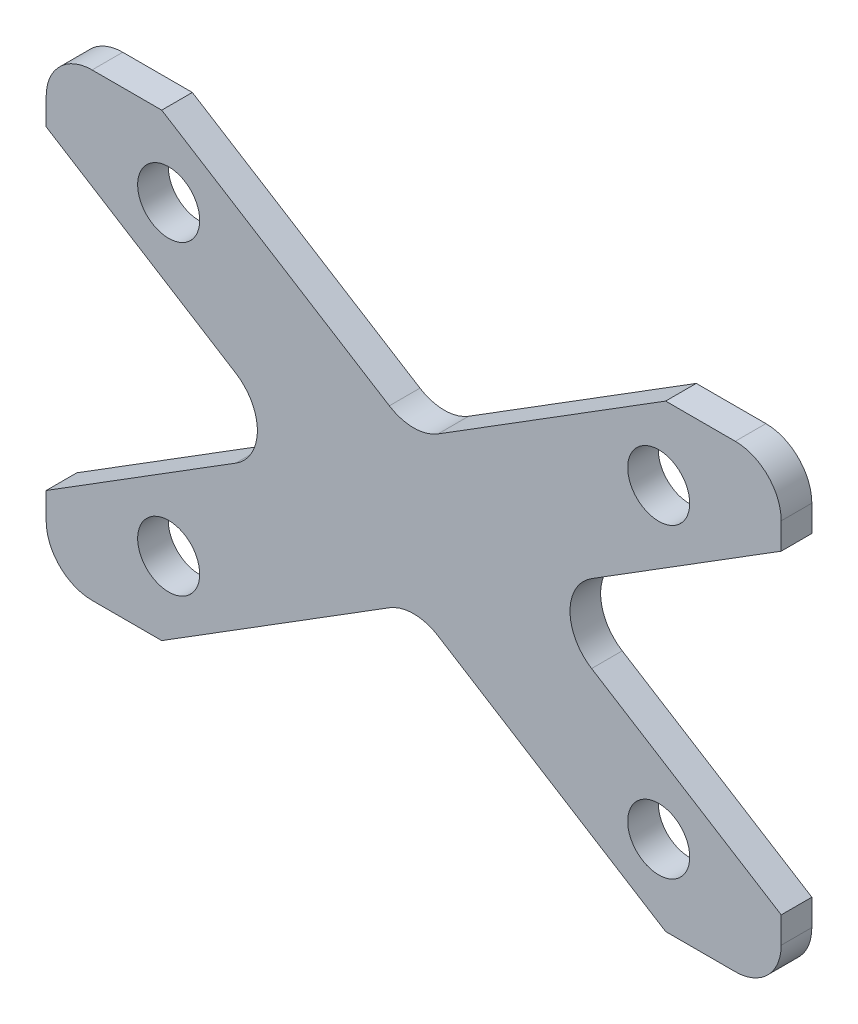
ISO-10303-21;
HEADER;
FILE_DESCRIPTION(('STEP AP214'),'2;1');
FILE_NAME('part.step','',(''),(''),'','','');
FILE_SCHEMA(('AUTOMOTIVE_DESIGN { 1 0 10303 214 1 1 1 1 }'));
ENDSEC;
DATA;
#1=APPLICATION_CONTEXT('core data for automotive mechanical design processes');
#2=APPLICATION_PROTOCOL_DEFINITION('international standard','automotive_design',2000,#1);
#3=PRODUCT_CONTEXT('',#1,'mechanical');
#4=PRODUCT('Part','Part','',(#3));
#5=PRODUCT_RELATED_PRODUCT_CATEGORY('part','',(#4));
#6=PRODUCT_DEFINITION_FORMATION('','',#4);
#7=PRODUCT_DEFINITION_CONTEXT('part definition',#1,'design');
#8=PRODUCT_DEFINITION('design','',#6,#7);
#9=PRODUCT_DEFINITION_SHAPE('','',#8);
#10=(LENGTH_UNIT() NAMED_UNIT(*) SI_UNIT(.MILLI.,.METRE.));
#11=(NAMED_UNIT(*) PLANE_ANGLE_UNIT() SI_UNIT($,.RADIAN.));
#12=(NAMED_UNIT(*) SI_UNIT($,.STERADIAN.) SOLID_ANGLE_UNIT());
#13=UNCERTAINTY_MEASURE_WITH_UNIT(LENGTH_MEASURE(1.E-05),#10,'distance_accuracy_value','');
#14=(GEOMETRIC_REPRESENTATION_CONTEXT(3) GLOBAL_UNCERTAINTY_ASSIGNED_CONTEXT((#13)) GLOBAL_UNIT_ASSIGNED_CONTEXT((#10,
#11,#12)) REPRESENTATION_CONTEXT('',''));
#15=CARTESIAN_POINT('',(0.,0.,0.));
#16=DIRECTION('',(0.,0.,1.));
#17=DIRECTION('',(1.,0.,0.));
#18=AXIS2_PLACEMENT_3D('',#15,#16,#17);
#19=CARTESIAN_POINT('',(0.,0.,2.));
#20=DIRECTION('',(0.,0.,1.));
#21=DIRECTION('',(1.,0.,0.));
#22=AXIS2_PLACEMENT_3D('',#19,#20,#21);
#23=PLANE('',#22);
#24=CARTESIAN_POINT('',(16.,-10.,2.));
#25=DIRECTION('',(0.,0.,1.));
#26=DIRECTION('',(1.,0.,0.));
#27=AXIS2_PLACEMENT_3D('',#24,#25,#26);
#28=CIRCLE('',#27,2.025);
#29=CARTESIAN_POINT('',(18.025,-10.,2.));
#30=VERTEX_POINT('',#29);
#31=EDGE_CURVE('E611',#30,#30,#28,.T.);
#32=ORIENTED_EDGE('',*,*,#31,.F.);
#33=EDGE_LOOP('',(#32));
#34=FACE_BOUND('',#33,.T.);
#35=CARTESIAN_POINT('',(-16.,10.,2.));
#36=DIRECTION('',(0.,0.,1.));
#37=DIRECTION('',(1.,0.,0.));
#38=AXIS2_PLACEMENT_3D('',#35,#36,#37);
#39=CIRCLE('',#38,2.025);
#40=CARTESIAN_POINT('',(-13.975,10.,2.));
#41=VERTEX_POINT('',#40);
#42=EDGE_CURVE('E394',#41,#41,#39,.T.);
#43=ORIENTED_EDGE('',*,*,#42,.F.);
#44=EDGE_LOOP('',(#43));
#45=FACE_BOUND('',#44,.T.);
#46=DIRECTION('',(0.,-1.,0.));
#47=VECTOR('',#46,1.);
#48=CARTESIAN_POINT('',(-24.,-10.2830094339717,2.));
#49=LINE('',#48,#47);
#50=CARTESIAN_POINT('',(-24.,-10.2830094339717,2.));
#51=VERTEX_POINT('',#50);
#52=CARTESIAN_POINT('',(-24.,-12.,2.));
#53=VERTEX_POINT('',#52);
#54=EDGE_CURVE('E368',#51,#53,#49,.T.);
#55=ORIENTED_EDGE('',*,*,#54,.T.);
#56=CARTESIAN_POINT('',(-21.,-12.,2.));
#57=DIRECTION('',(0.,0.,1.));
#58=DIRECTION('',(1.,0.,0.));
#59=AXIS2_PLACEMENT_3D('',#56,#57,#58);
#60=CIRCLE('',#59,3.);
#61=CARTESIAN_POINT('',(-21.,-15.,2.));
#62=VERTEX_POINT('',#61);
#63=EDGE_CURVE('E292',#53,#62,#60,.T.);
#64=ORIENTED_EDGE('',*,*,#63,.T.);
#65=DIRECTION('',(1.,0.,0.));
#66=VECTOR('',#65,1.);
#67=CARTESIAN_POINT('',(-24.,-15.,2.));
#68=LINE('',#67,#66);
#69=CARTESIAN_POINT('',(-16.4528150943547,-15.,2.));
#70=VERTEX_POINT('',#69);
#71=EDGE_CURVE('E372',#62,#70,#68,.T.);
#72=ORIENTED_EDGE('',*,*,#71,.T.);
#73=DIRECTION('',(0.847998304005087,0.52999894000318,0.));
#74=VECTOR('',#73,1.);
#75=CARTESIAN_POINT('',(-16.4528150943547,-15.,2.));
#76=LINE('',#75,#74);
#77=CARTESIAN_POINT('',(-1.58999682000954,-5.71073857853424,2.));
#78=VERTEX_POINT('',#77);
#79=EDGE_CURVE('E380',#70,#78,#76,.T.);
#80=ORIENTED_EDGE('',*,*,#79,.T.);
#81=CARTESIAN_POINT('',(0.,-8.2547334905495,2.));
#82=DIRECTION('',(0.,0.,1.));
#83=DIRECTION('',(1.,0.,0.));
#84=AXIS2_PLACEMENT_3D('',#81,#82,#83);
#85=CIRCLE('',#84,3.);
#86=CARTESIAN_POINT('',(1.58999682000955,-5.71073857853424,2.));
#87=VERTEX_POINT('',#86);
#88=EDGE_CURVE('E329',#78,#87,#85,.F.);
#89=ORIENTED_EDGE('',*,*,#88,.T.);
#90=DIRECTION('',(0.847998304005088,-0.529998940003181,0.));
#91=VECTOR('',#90,1.);
#92=CARTESIAN_POINT('',(0.,-4.71699056602827,2.));
#93=LINE('',#92,#91);
#94=CARTESIAN_POINT('',(16.4528150943547,-15.,2.));
#95=VERTEX_POINT('',#94);
#96=EDGE_CURVE('E384',#87,#95,#93,.T.);
#97=ORIENTED_EDGE('',*,*,#96,.T.);
#98=DIRECTION('',(1.,0.,0.));
#99=VECTOR('',#98,1.);
#100=CARTESIAN_POINT('',(16.4528150943547,-15.,2.));
#101=LINE('',#100,#99);
#102=CARTESIAN_POINT('',(21.,-15.,2.));
#103=VERTEX_POINT('',#102);
#104=EDGE_CURVE('E387',#95,#103,#101,.T.);
#105=ORIENTED_EDGE('',*,*,#104,.T.);
#106=CARTESIAN_POINT('',(21.,-12.,2.));
#107=DIRECTION('',(0.,0.,1.));
#108=DIRECTION('',(1.,0.,0.));
#109=AXIS2_PLACEMENT_3D('',#106,#107,#108);
#110=CIRCLE('',#109,3.);
#111=CARTESIAN_POINT('',(24.,-12.,2.));
#112=VERTEX_POINT('',#111);
#113=EDGE_CURVE('E208',#103,#112,#110,.T.);
#114=ORIENTED_EDGE('',*,*,#113,.T.);
#115=DIRECTION('',(0.,1.,0.));
#116=VECTOR('',#115,1.);
#117=CARTESIAN_POINT('',(24.,-10.2830094339717,2.));
#118=LINE('',#117,#116);
#119=CARTESIAN_POINT('',(24.,-10.2830094339717,2.));
#120=VERTEX_POINT('',#119);
#121=EDGE_CURVE('E201',#112,#120,#118,.T.);
#122=ORIENTED_EDGE('',*,*,#121,.T.);
#123=DIRECTION('',(-0.847998304005088,0.52999894000318,0.));
#124=VECTOR('',#123,1.);
#125=CARTESIAN_POINT('',(7.54718490564529,0.,2.));
#126=LINE('',#125,#124);
#127=CARTESIAN_POINT('',(11.6175767648697,-2.54399491201526,2.));
#128=VERTEX_POINT('',#127);
#129=EDGE_CURVE('E205',#120,#128,#126,.T.);
#130=ORIENTED_EDGE('',*,*,#129,.T.);
#131=CARTESIAN_POINT('',(13.2075735848792,0.,2.));
#132=DIRECTION('',(0.,0.,1.));
#133=DIRECTION('',(1.,0.,0.));
#134=AXIS2_PLACEMENT_3D('',#131,#132,#133);
#135=CIRCLE('',#134,3.);
#136=CARTESIAN_POINT('',(11.6175767648697,2.54399491201526,2.));
#137=VERTEX_POINT('',#136);
#138=EDGE_CURVE('E323',#128,#137,#135,.F.);
#139=ORIENTED_EDGE('',*,*,#138,.T.);
#140=DIRECTION('',(0.847998304005087,0.529998940003181,0.));
#141=VECTOR('',#140,1.);
#142=CARTESIAN_POINT('',(7.54718490564529,0.,2.));
#143=LINE('',#142,#141);
#144=CARTESIAN_POINT('',(24.,10.2830094339717,2.));
#145=VERTEX_POINT('',#144);
#146=EDGE_CURVE('E224',#137,#145,#143,.T.);
#147=ORIENTED_EDGE('',*,*,#146,.T.);
#148=DIRECTION('',(0.,1.,0.));
#149=VECTOR('',#148,1.);
#150=CARTESIAN_POINT('',(24.,15.,2.));
#151=LINE('',#150,#149);
#152=CARTESIAN_POINT('',(24.,12.,2.));
#153=VERTEX_POINT('',#152);
#154=EDGE_CURVE('E589',#145,#153,#151,.T.);
#155=ORIENTED_EDGE('',*,*,#154,.T.);
#156=CARTESIAN_POINT('',(21.,12.,2.));
#157=DIRECTION('',(0.,0.,1.));
#158=DIRECTION('',(1.,0.,0.));
#159=AXIS2_PLACEMENT_3D('',#156,#157,#158);
#160=CIRCLE('',#159,3.);
#161=CARTESIAN_POINT('',(21.,15.,2.));
#162=VERTEX_POINT('',#161);
#163=EDGE_CURVE('E287',#153,#162,#160,.T.);
#164=ORIENTED_EDGE('',*,*,#163,.T.);
#165=DIRECTION('',(-1.,0.,0.));
#166=VECTOR('',#165,1.);
#167=CARTESIAN_POINT('',(16.4528150943547,15.,2.));
#168=LINE('',#167,#166);
#169=CARTESIAN_POINT('',(16.4528150943547,15.,2.));
#170=VERTEX_POINT('',#169);
#171=EDGE_CURVE('E483',#162,#170,#168,.T.);
#172=ORIENTED_EDGE('',*,*,#171,.T.);
#173=DIRECTION('',(-0.847998304005088,-0.52999894000318,0.));
#174=VECTOR('',#173,1.);
#175=CARTESIAN_POINT('',(0.,4.71699056602831,2.));
#176=LINE('',#175,#174);
#177=CARTESIAN_POINT('',(1.58999682000954,5.71073857853427,2.));
#178=VERTEX_POINT('',#177);
#179=EDGE_CURVE('E461',#170,#178,#176,.T.);
#180=ORIENTED_EDGE('',*,*,#179,.T.);
#181=CARTESIAN_POINT('',(0.,8.25473349054954,2.));
#182=DIRECTION('',(0.,0.,1.));
#183=DIRECTION('',(1.,0.,0.));
#184=AXIS2_PLACEMENT_3D('',#181,#182,#183);
#185=CIRCLE('',#184,3.);
#186=CARTESIAN_POINT('',(-1.58999682000954,5.71073857853427,2.));
#187=VERTEX_POINT('',#186);
#188=EDGE_CURVE('E317',#178,#187,#185,.F.);
#189=ORIENTED_EDGE('',*,*,#188,.T.);
#190=DIRECTION('',(-0.847998304005088,0.529998940003179,0.));
#191=VECTOR('',#190,1.);
#192=CARTESIAN_POINT('',(-16.4528150943547,15.,2.));
#193=LINE('',#192,#191);
#194=CARTESIAN_POINT('',(-16.4528150943547,15.,2.));
#195=VERTEX_POINT('',#194);
#196=EDGE_CURVE('E475',#187,#195,#193,.T.);
#197=ORIENTED_EDGE('',*,*,#196,.T.);
#198=DIRECTION('',(-1.,0.,0.));
#199=VECTOR('',#198,1.);
#200=CARTESIAN_POINT('',(-24.,15.,2.));
#201=LINE('',#200,#199);
#202=CARTESIAN_POINT('',(-21.,15.,2.));
#203=VERTEX_POINT('',#202);
#204=EDGE_CURVE('E478',#195,#203,#201,.T.);
#205=ORIENTED_EDGE('',*,*,#204,.T.);
#206=CARTESIAN_POINT('',(-21.,12.,2.));
#207=DIRECTION('',(0.,0.,1.));
#208=DIRECTION('',(1.,0.,0.));
#209=AXIS2_PLACEMENT_3D('',#206,#207,#208);
#210=CIRCLE('',#209,3.);
#211=CARTESIAN_POINT('',(-24.,12.,2.));
#212=VERTEX_POINT('',#211);
#213=EDGE_CURVE('E62',#203,#212,#210,.T.);
#214=ORIENTED_EDGE('',*,*,#213,.T.);
#215=DIRECTION('',(0.,-1.,0.));
#216=VECTOR('',#215,1.);
#217=CARTESIAN_POINT('',(-24.,15.,2.));
#218=LINE('',#217,#216);
#219=CARTESIAN_POINT('',(-24.,10.2830094339717,2.));
#220=VERTEX_POINT('',#219);
#221=EDGE_CURVE('E374',#212,#220,#218,.T.);
#222=ORIENTED_EDGE('',*,*,#221,.T.);
#223=DIRECTION('',(0.847998304005088,-0.52999894000318,0.));
#224=VECTOR('',#223,1.);
#225=CARTESIAN_POINT('',(-24.,10.2830094339717,2.));
#226=LINE('',#225,#224);
#227=CARTESIAN_POINT('',(-11.6175767648697,2.54399491201527,2.));
#228=VERTEX_POINT('',#227);
#229=EDGE_CURVE('E361',#220,#228,#226,.T.);
#230=ORIENTED_EDGE('',*,*,#229,.T.);
#231=CARTESIAN_POINT('',(-13.2075735848793,0.,2.));
#232=DIRECTION('',(0.,0.,1.));
#233=DIRECTION('',(1.,0.,0.));
#234=AXIS2_PLACEMENT_3D('',#231,#232,#233);
#235=CIRCLE('',#234,3.);
#236=CARTESIAN_POINT('',(-11.6175767648697,-2.54399491201526,2.));
#237=VERTEX_POINT('',#236);
#238=EDGE_CURVE('E11',#228,#237,#235,.F.);
#239=ORIENTED_EDGE('',*,*,#238,.T.);
#240=DIRECTION('',(-0.847998304005088,-0.52999894000318,0.));
#241=VECTOR('',#240,1.);
#242=CARTESIAN_POINT('',(-24.,-10.2830094339717,2.));
#243=LINE('',#242,#241);
#244=EDGE_CURVE('E359',#237,#51,#243,.T.);
#245=ORIENTED_EDGE('',*,*,#244,.T.);
#246=EDGE_LOOP('',(#55,#64,#72,#80,#89,#97,#105,#114,#122,#130,#139,#147,#155,#164,#172,#180,
#189,#197,#205,#214,#222,#230,#239,#245));
#247=FACE_BOUND('',#246,.T.);
#248=CARTESIAN_POINT('',(16.,10.,2.));
#249=DIRECTION('',(0.,0.,1.));
#250=DIRECTION('',(1.,0.,0.));
#251=AXIS2_PLACEMENT_3D('',#248,#249,#250);
#252=CIRCLE('',#251,2.025);
#253=CARTESIAN_POINT('',(18.025,10.,2.));
#254=VERTEX_POINT('',#253);
#255=EDGE_CURVE('E603',#254,#254,#252,.T.);
#256=ORIENTED_EDGE('',*,*,#255,.F.);
#257=EDGE_LOOP('',(#256));
#258=FACE_BOUND('',#257,.T.);
#259=CARTESIAN_POINT('',(-15.9999999999998,-10.,2.));
#260=DIRECTION('',(0.,0.,1.));
#261=DIRECTION('',(1.,0.,0.));
#262=AXIS2_PLACEMENT_3D('',#259,#260,#261);
#263=CIRCLE('',#262,2.025);
#264=CARTESIAN_POINT('',(-13.9749999999998,-10.,2.));
#265=VERTEX_POINT('',#264);
#266=EDGE_CURVE('E619',#265,#265,#263,.T.);
#267=ORIENTED_EDGE('',*,*,#266,.F.);
#268=EDGE_LOOP('',(#267));
#269=FACE_BOUND('',#268,.T.);
#270=ADVANCED_FACE('F38',(#34,#45,#247,#258,#269),#23,.T.);
#271=CARTESIAN_POINT('',(0.,0.,0.));
#272=DIRECTION('',(0.,0.,1.));
#273=DIRECTION('',(1.,0.,0.));
#274=AXIS2_PLACEMENT_3D('',#271,#272,#273);
#275=PLANE('',#274);
#276=DIRECTION('',(1.,0.,0.));
#277=VECTOR('',#276,1.);
#278=CARTESIAN_POINT('',(-24.,-15.,0.));
#279=LINE('',#278,#277);
#280=CARTESIAN_POINT('',(-21.,-15.,0.));
#281=VERTEX_POINT('',#280);
#282=CARTESIAN_POINT('',(-16.4528150943547,-15.,0.));
#283=VERTEX_POINT('',#282);
#284=EDGE_CURVE('E426',#281,#283,#279,.T.);
#285=ORIENTED_EDGE('',*,*,#284,.F.);
#286=CARTESIAN_POINT('',(-21.,-12.,0.));
#287=DIRECTION('',(0.,0.,1.));
#288=DIRECTION('',(1.,0.,0.));
#289=AXIS2_PLACEMENT_3D('',#286,#287,#288);
#290=CIRCLE('',#289,3.);
#291=CARTESIAN_POINT('',(-24.,-12.,0.));
#292=VERTEX_POINT('',#291);
#293=EDGE_CURVE('E279',#281,#292,#290,.F.);
#294=ORIENTED_EDGE('',*,*,#293,.T.);
#295=DIRECTION('',(0.,-1.,0.));
#296=VECTOR('',#295,1.);
#297=CARTESIAN_POINT('',(-24.,-10.2830094339717,0.));
#298=LINE('',#297,#296);
#299=CARTESIAN_POINT('',(-24.,-10.2830094339717,0.));
#300=VERTEX_POINT('',#299);
#301=EDGE_CURVE('E422',#300,#292,#298,.T.);
#302=ORIENTED_EDGE('',*,*,#301,.F.);
#303=DIRECTION('',(-0.847998304005088,-0.52999894000318,0.));
#304=VECTOR('',#303,1.);
#305=CARTESIAN_POINT('',(-24.,-10.2830094339717,0.));
#306=LINE('',#305,#304);
#307=CARTESIAN_POINT('',(-11.6175767648697,-2.54399491201526,0.));
#308=VERTEX_POINT('',#307);
#309=EDGE_CURVE('E342',#308,#300,#306,.T.);
#310=ORIENTED_EDGE('',*,*,#309,.F.);
#311=CARTESIAN_POINT('',(-13.2075735848793,0.,0.));
#312=DIRECTION('',(0.,0.,1.));
#313=DIRECTION('',(1.,0.,0.));
#314=AXIS2_PLACEMENT_3D('',#311,#312,#313);
#315=CIRCLE('',#314,3.);
#316=CARTESIAN_POINT('',(-11.6175767648697,2.54399491201527,0.));
#317=VERTEX_POINT('',#316);
#318=EDGE_CURVE('E47',#308,#317,#315,.T.);
#319=ORIENTED_EDGE('',*,*,#318,.T.);
#320=DIRECTION('',(0.847998304005088,-0.52999894000318,0.));
#321=VECTOR('',#320,1.);
#322=CARTESIAN_POINT('',(-24.,10.2830094339717,0.));
#323=LINE('',#322,#321);
#324=CARTESIAN_POINT('',(-24.,10.2830094339717,0.));
#325=VERTEX_POINT('',#324);
#326=EDGE_CURVE('E340',#325,#317,#323,.T.);
#327=ORIENTED_EDGE('',*,*,#326,.F.);
#328=DIRECTION('',(0.,-1.,0.));
#329=VECTOR('',#328,1.);
#330=CARTESIAN_POINT('',(-24.,15.,0.));
#331=LINE('',#330,#329);
#332=CARTESIAN_POINT('',(-24.,12.,0.));
#333=VERTEX_POINT('',#332);
#334=EDGE_CURVE('E354',#333,#325,#331,.T.);
#335=ORIENTED_EDGE('',*,*,#334,.F.);
#336=CARTESIAN_POINT('',(-21.,12.,0.));
#337=DIRECTION('',(0.,0.,1.));
#338=DIRECTION('',(1.,0.,0.));
#339=AXIS2_PLACEMENT_3D('',#336,#337,#338);
#340=CIRCLE('',#339,3.);
#341=CARTESIAN_POINT('',(-21.,15.,0.));
#342=VERTEX_POINT('',#341);
#343=EDGE_CURVE('E270',#333,#342,#340,.F.);
#344=ORIENTED_EDGE('',*,*,#343,.T.);
#345=DIRECTION('',(-1.,0.,0.));
#346=VECTOR('',#345,1.);
#347=CARTESIAN_POINT('',(-24.,15.,0.));
#348=LINE('',#347,#346);
#349=CARTESIAN_POINT('',(-16.4528150943547,15.,0.));
#350=VERTEX_POINT('',#349);
#351=EDGE_CURVE('E414',#350,#342,#348,.T.);
#352=ORIENTED_EDGE('',*,*,#351,.F.);
#353=DIRECTION('',(-0.847998304005088,0.529998940003179,0.));
#354=VECTOR('',#353,1.);
#355=CARTESIAN_POINT('',(-16.4528150943547,15.,0.));
#356=LINE('',#355,#354);
#357=CARTESIAN_POINT('',(-1.58999682000954,5.71073857853427,0.));
#358=VERTEX_POINT('',#357);
#359=EDGE_CURVE('E411',#358,#350,#356,.T.);
#360=ORIENTED_EDGE('',*,*,#359,.F.);
#361=CARTESIAN_POINT('',(0.,8.25473349054954,0.));
#362=DIRECTION('',(0.,0.,1.));
#363=DIRECTION('',(1.,0.,0.));
#364=AXIS2_PLACEMENT_3D('',#361,#362,#363);
#365=CIRCLE('',#364,3.);
#366=CARTESIAN_POINT('',(1.58999682000954,5.71073857853427,0.));
#367=VERTEX_POINT('',#366);
#368=EDGE_CURVE('E314',#358,#367,#365,.T.);
#369=ORIENTED_EDGE('',*,*,#368,.T.);
#370=DIRECTION('',(-0.847998304005088,-0.52999894000318,0.));
#371=VECTOR('',#370,1.);
#372=CARTESIAN_POINT('',(0.,4.71699056602831,0.));
#373=LINE('',#372,#371);
#374=CARTESIAN_POINT('',(16.4528150943547,15.,0.));
#375=VERTEX_POINT('',#374);
#376=EDGE_CURVE('E407',#375,#367,#373,.T.);
#377=ORIENTED_EDGE('',*,*,#376,.F.);
#378=DIRECTION('',(-1.,0.,0.));
#379=VECTOR('',#378,1.);
#380=CARTESIAN_POINT('',(16.4528150943547,15.,0.));
#381=LINE('',#380,#379);
#382=CARTESIAN_POINT('',(21.,15.,0.));
#383=VERTEX_POINT('',#382);
#384=EDGE_CURVE('E404',#383,#375,#381,.T.);
#385=ORIENTED_EDGE('',*,*,#384,.F.);
#386=CARTESIAN_POINT('',(21.,12.,0.));
#387=DIRECTION('',(0.,0.,1.));
#388=DIRECTION('',(1.,0.,0.));
#389=AXIS2_PLACEMENT_3D('',#386,#387,#388);
#390=CIRCLE('',#389,3.);
#391=CARTESIAN_POINT('',(24.,12.,0.));
#392=VERTEX_POINT('',#391);
#393=EDGE_CURVE('E273',#383,#392,#390,.F.);
#394=ORIENTED_EDGE('',*,*,#393,.T.);
#395=DIRECTION('',(0.,1.,0.));
#396=VECTOR('',#395,1.);
#397=CARTESIAN_POINT('',(24.,15.,0.));
#398=LINE('',#397,#396);
#399=CARTESIAN_POINT('',(24.,10.2830094339717,0.));
#400=VERTEX_POINT('',#399);
#401=EDGE_CURVE('E400',#400,#392,#398,.T.);
#402=ORIENTED_EDGE('',*,*,#401,.F.);
#403=DIRECTION('',(0.847998304005087,0.529998940003181,0.));
#404=VECTOR('',#403,1.);
#405=CARTESIAN_POINT('',(7.54718490564529,0.,0.));
#406=LINE('',#405,#404);
#407=CARTESIAN_POINT('',(11.6175767648697,2.54399491201526,0.));
#408=VERTEX_POINT('',#407);
#409=EDGE_CURVE('E397',#408,#400,#406,.T.);
#410=ORIENTED_EDGE('',*,*,#409,.F.);
#411=CARTESIAN_POINT('',(13.2075735848792,0.,0.));
#412=DIRECTION('',(0.,0.,1.));
#413=DIRECTION('',(1.,0.,0.));
#414=AXIS2_PLACEMENT_3D('',#411,#412,#413);
#415=CIRCLE('',#414,3.);
#416=CARTESIAN_POINT('',(11.6175767648697,-2.54399491201526,0.));
#417=VERTEX_POINT('',#416);
#418=EDGE_CURVE('E320',#408,#417,#415,.T.);
#419=ORIENTED_EDGE('',*,*,#418,.T.);
#420=DIRECTION('',(-0.847998304005088,0.52999894000318,0.));
#421=VECTOR('',#420,1.);
#422=CARTESIAN_POINT('',(7.54718490564529,0.,0.));
#423=LINE('',#422,#421);
#424=CARTESIAN_POINT('',(24.,-10.2830094339717,0.));
#425=VERTEX_POINT('',#424);
#426=EDGE_CURVE('E393',#425,#417,#423,.T.);
#427=ORIENTED_EDGE('',*,*,#426,.F.);
#428=DIRECTION('',(0.,1.,0.));
#429=VECTOR('',#428,1.);
#430=CARTESIAN_POINT('',(24.,-10.2830094339717,0.));
#431=LINE('',#430,#429);
#432=CARTESIAN_POINT('',(24.,-12.,0.));
#433=VERTEX_POINT('',#432);
#434=EDGE_CURVE('E228',#433,#425,#431,.T.);
#435=ORIENTED_EDGE('',*,*,#434,.F.);
#436=CARTESIAN_POINT('',(21.,-12.,0.));
#437=DIRECTION('',(0.,0.,1.));
#438=DIRECTION('',(1.,0.,0.));
#439=AXIS2_PLACEMENT_3D('',#436,#437,#438);
#440=CIRCLE('',#439,3.);
#441=CARTESIAN_POINT('',(21.,-15.,0.));
#442=VERTEX_POINT('',#441);
#443=EDGE_CURVE('E276',#433,#442,#440,.F.);
#444=ORIENTED_EDGE('',*,*,#443,.T.);
#445=DIRECTION('',(1.,0.,0.));
#446=VECTOR('',#445,1.);
#447=CARTESIAN_POINT('',(16.4528150943547,-15.,0.));
#448=LINE('',#447,#446);
#449=CARTESIAN_POINT('',(16.4528150943547,-15.,0.));
#450=VERTEX_POINT('',#449);
#451=EDGE_CURVE('E214',#450,#442,#448,.T.);
#452=ORIENTED_EDGE('',*,*,#451,.F.);
#453=DIRECTION('',(0.847998304005088,-0.529998940003181,0.));
#454=VECTOR('',#453,1.);
#455=CARTESIAN_POINT('',(0.,-4.71699056602827,0.));
#456=LINE('',#455,#454);
#457=CARTESIAN_POINT('',(1.58999682000955,-5.71073857853424,0.));
#458=VERTEX_POINT('',#457);
#459=EDGE_CURVE('E433',#458,#450,#456,.T.);
#460=ORIENTED_EDGE('',*,*,#459,.F.);
#461=CARTESIAN_POINT('',(0.,-8.2547334905495,0.));
#462=DIRECTION('',(0.,0.,1.));
#463=DIRECTION('',(1.,0.,0.));
#464=AXIS2_PLACEMENT_3D('',#461,#462,#463);
#465=CIRCLE('',#464,3.);
#466=CARTESIAN_POINT('',(-1.58999682000954,-5.71073857853424,0.));
#467=VERTEX_POINT('',#466);
#468=EDGE_CURVE('E326',#458,#467,#465,.T.);
#469=ORIENTED_EDGE('',*,*,#468,.T.);
#470=DIRECTION('',(0.847998304005087,0.52999894000318,0.));
#471=VECTOR('',#470,1.);
#472=CARTESIAN_POINT('',(-16.4528150943547,-15.,0.));
#473=LINE('',#472,#471);
#474=EDGE_CURVE('E429',#283,#467,#473,.T.);
#475=ORIENTED_EDGE('',*,*,#474,.F.);
#476=EDGE_LOOP('',(#285,#294,#302,#310,#319,#327,#335,#344,#352,#360,#369,#377,#385,#394,#402,
#410,#419,#427,#435,#444,#452,#460,#469,#475));
#477=FACE_BOUND('',#476,.T.);
#478=CARTESIAN_POINT('',(-16.,10.,0.));
#479=DIRECTION('',(0.,0.,1.));
#480=DIRECTION('',(1.,0.,0.));
#481=AXIS2_PLACEMENT_3D('',#478,#479,#480);
#482=CIRCLE('',#481,2.025);
#483=CARTESIAN_POINT('',(-13.975,10.,0.));
#484=VERTEX_POINT('',#483);
#485=EDGE_CURVE('E599',#484,#484,#482,.T.);
#486=ORIENTED_EDGE('',*,*,#485,.T.);
#487=EDGE_LOOP('',(#486));
#488=FACE_BOUND('',#487,.T.);
#489=CARTESIAN_POINT('',(16.,10.,0.));
#490=DIRECTION('',(0.,0.,1.));
#491=DIRECTION('',(1.,0.,0.));
#492=AXIS2_PLACEMENT_3D('',#489,#490,#491);
#493=CIRCLE('',#492,2.025);
#494=CARTESIAN_POINT('',(18.025,10.,0.));
#495=VERTEX_POINT('',#494);
#496=EDGE_CURVE('E607',#495,#495,#493,.T.);
#497=ORIENTED_EDGE('',*,*,#496,.T.);
#498=EDGE_LOOP('',(#497));
#499=FACE_BOUND('',#498,.T.);
#500=CARTESIAN_POINT('',(16.,-10.,0.));
#501=DIRECTION('',(0.,0.,1.));
#502=DIRECTION('',(1.,0.,0.));
#503=AXIS2_PLACEMENT_3D('',#500,#501,#502);
#504=CIRCLE('',#503,2.025);
#505=CARTESIAN_POINT('',(18.025,-10.,0.));
#506=VERTEX_POINT('',#505);
#507=EDGE_CURVE('E615',#506,#506,#504,.T.);
#508=ORIENTED_EDGE('',*,*,#507,.T.);
#509=EDGE_LOOP('',(#508));
#510=FACE_BOUND('',#509,.T.);
#511=CARTESIAN_POINT('',(-15.9999999999998,-10.,0.));
#512=DIRECTION('',(0.,0.,1.));
#513=DIRECTION('',(1.,0.,0.));
#514=AXIS2_PLACEMENT_3D('',#511,#512,#513);
#515=CIRCLE('',#514,2.025);
#516=CARTESIAN_POINT('',(-13.9749999999998,-10.,0.));
#517=VERTEX_POINT('',#516);
#518=EDGE_CURVE('E623',#517,#517,#515,.T.);
#519=ORIENTED_EDGE('',*,*,#518,.T.);
#520=EDGE_LOOP('',(#519));
#521=FACE_BOUND('',#520,.T.);
#522=ADVANCED_FACE('F337',(#477,#488,#499,#510,#521),#275,.F.);
#523=CARTESIAN_POINT('',(24.,-10.2830094339717,2.));
#524=DIRECTION('',(-1.,0.,0.));
#525=DIRECTION('',(0.,-1.,0.));
#526=AXIS2_PLACEMENT_3D('',#523,#524,#525);
#527=PLANE('',#526);
#528=ORIENTED_EDGE('',*,*,#121,.F.);
#529=DIRECTION('',(0.,0.,-1.));
#530=VECTOR('',#529,1.);
#531=CARTESIAN_POINT('',(24.,-12.,2.));
#532=LINE('',#531,#530);
#533=EDGE_CURVE('E295',#112,#433,#532,.T.);
#534=ORIENTED_EDGE('',*,*,#533,.T.);
#535=ORIENTED_EDGE('',*,*,#434,.T.);
#536=DIRECTION('',(0.,0.,-1.));
#537=VECTOR('',#536,1.);
#538=CARTESIAN_POINT('',(24.,-10.2830094339717,2.));
#539=LINE('',#538,#537);
#540=EDGE_CURVE('E220',#120,#425,#539,.T.);
#541=ORIENTED_EDGE('',*,*,#540,.F.);
#542=EDGE_LOOP('',(#528,#534,#535,#541));
#543=FACE_BOUND('',#542,.T.);
#544=ADVANCED_FACE('F226',(#543),#527,.F.);
#545=CARTESIAN_POINT('',(7.54718490564529,0.,2.));
#546=DIRECTION('',(-0.52999894000318,-0.847998304005088,0.));
#547=DIRECTION('',(0.847998304005088,-0.52999894000318,0.));
#548=AXIS2_PLACEMENT_3D('',#545,#546,#547);
#549=PLANE('',#548);
#550=ORIENTED_EDGE('',*,*,#426,.T.);
#551=DIRECTION('',(0.,0.,-1.));
#552=VECTOR('',#551,1.);
#553=CARTESIAN_POINT('',(11.6175767648697,-2.54399491201526,2.));
#554=LINE('',#553,#552);
#555=EDGE_CURVE('E222',#417,#128,#554,.F.);
#556=ORIENTED_EDGE('',*,*,#555,.T.);
#557=ORIENTED_EDGE('',*,*,#129,.F.);
#558=ORIENTED_EDGE('',*,*,#540,.T.);
#559=EDGE_LOOP('',(#550,#556,#557,#558));
#560=FACE_BOUND('',#559,.T.);
#561=ADVANCED_FACE('F219',(#560),#549,.F.);
#562=CARTESIAN_POINT('',(7.54718490564529,0.,2.));
#563=DIRECTION('',(-0.529998940003181,0.847998304005087,0.));
#564=DIRECTION('',(-0.847998304005087,-0.529998940003181,0.));
#565=AXIS2_PLACEMENT_3D('',#562,#563,#564);
#566=PLANE('',#565);
#567=ORIENTED_EDGE('',*,*,#146,.F.);
#568=DIRECTION('',(0.,0.,-1.));
#569=VECTOR('',#568,1.);
#570=CARTESIAN_POINT('',(11.6175767648697,2.54399491201526,0.));
#571=LINE('',#570,#569);
#572=EDGE_CURVE('E246',#137,#408,#571,.T.);
#573=ORIENTED_EDGE('',*,*,#572,.T.);
#574=ORIENTED_EDGE('',*,*,#409,.T.);
#575=DIRECTION('',(0.,0.,-1.));
#576=VECTOR('',#575,1.);
#577=CARTESIAN_POINT('',(24.,10.2830094339717,2.));
#578=LINE('',#577,#576);
#579=EDGE_CURVE('E232',#145,#400,#578,.T.);
#580=ORIENTED_EDGE('',*,*,#579,.F.);
#581=EDGE_LOOP('',(#567,#573,#574,#580));
#582=FACE_BOUND('',#581,.T.);
#583=ADVANCED_FACE('F551',(#582),#566,.F.);
#584=CARTESIAN_POINT('',(24.,15.,2.));
#585=DIRECTION('',(-1.,0.,0.));
#586=DIRECTION('',(0.,-1.,0.));
#587=AXIS2_PLACEMENT_3D('',#584,#585,#586);
#588=PLANE('',#587);
#589=ORIENTED_EDGE('',*,*,#401,.T.);
#590=DIRECTION('',(0.,0.,-1.));
#591=VECTOR('',#590,1.);
#592=CARTESIAN_POINT('',(24.,12.,2.));
#593=LINE('',#592,#591);
#594=EDGE_CURVE('E304',#392,#153,#593,.F.);
#595=ORIENTED_EDGE('',*,*,#594,.T.);
#596=ORIENTED_EDGE('',*,*,#154,.F.);
#597=ORIENTED_EDGE('',*,*,#579,.T.);
#598=EDGE_LOOP('',(#589,#595,#596,#597));
#599=FACE_BOUND('',#598,.T.);
#600=ADVANCED_FACE('F548',(#599),#588,.F.);
#601=CARTESIAN_POINT('',(16.4528150943547,15.,2.));
#602=DIRECTION('',(0.,-1.,0.));
#603=DIRECTION('',(1.,0.,0.));
#604=AXIS2_PLACEMENT_3D('',#601,#602,#603);
#605=PLANE('',#604);
#606=ORIENTED_EDGE('',*,*,#171,.F.);
#607=DIRECTION('',(0.,0.,-1.));
#608=VECTOR('',#607,1.);
#609=CARTESIAN_POINT('',(21.,15.,2.));
#610=LINE('',#609,#608);
#611=EDGE_CURVE('E300',#162,#383,#610,.T.);
#612=ORIENTED_EDGE('',*,*,#611,.T.);
#613=ORIENTED_EDGE('',*,*,#384,.T.);
#614=DIRECTION('',(0.,0.,-1.));
#615=VECTOR('',#614,1.);
#616=CARTESIAN_POINT('',(16.4528150943547,15.,2.));
#617=LINE('',#616,#615);
#618=EDGE_CURVE('E240',#170,#375,#617,.T.);
#619=ORIENTED_EDGE('',*,*,#618,.F.);
#620=EDGE_LOOP('',(#606,#612,#613,#619));
#621=FACE_BOUND('',#620,.T.);
#622=ADVANCED_FACE('F545',(#621),#605,.F.);
#623=CARTESIAN_POINT('',(0.,4.71699056602831,2.));
#624=DIRECTION('',(0.52999894000318,-0.847998304005088,0.));
#625=DIRECTION('',(0.847998304005088,0.52999894000318,0.));
#626=AXIS2_PLACEMENT_3D('',#623,#624,#625);
#627=PLANE('',#626);
#628=ORIENTED_EDGE('',*,*,#376,.T.);
#629=DIRECTION('',(0.,0.,-1.));
#630=VECTOR('',#629,1.);
#631=CARTESIAN_POINT('',(1.58999682000954,5.71073857853427,2.));
#632=LINE('',#631,#630);
#633=EDGE_CURVE('E237',#367,#178,#632,.F.);
#634=ORIENTED_EDGE('',*,*,#633,.T.);
#635=ORIENTED_EDGE('',*,*,#179,.F.);
#636=ORIENTED_EDGE('',*,*,#618,.T.);
#637=EDGE_LOOP('',(#628,#634,#635,#636));
#638=FACE_BOUND('',#637,.T.);
#639=ADVANCED_FACE('F458',(#638),#627,.F.);
#640=CARTESIAN_POINT('',(-16.4528150943547,15.,2.));
#641=DIRECTION('',(-0.529998940003179,-0.847998304005088,0.));
#642=DIRECTION('',(0.847998304005088,-0.52999894000318,0.));
#643=AXIS2_PLACEMENT_3D('',#640,#641,#642);
#644=PLANE('',#643);
#645=ORIENTED_EDGE('',*,*,#196,.F.);
#646=DIRECTION('',(0.,0.,-1.));
#647=VECTOR('',#646,1.);
#648=CARTESIAN_POINT('',(-1.58999682000954,5.71073857853427,0.));
#649=LINE('',#648,#647);
#650=EDGE_CURVE('E231',#187,#358,#649,.T.);
#651=ORIENTED_EDGE('',*,*,#650,.T.);
#652=ORIENTED_EDGE('',*,*,#359,.T.);
#653=DIRECTION('',(0.,0.,-1.));
#654=VECTOR('',#653,1.);
#655=CARTESIAN_POINT('',(-16.4528150943547,15.,2.));
#656=LINE('',#655,#654);
#657=EDGE_CURVE('E449',#195,#350,#656,.T.);
#658=ORIENTED_EDGE('',*,*,#657,.F.);
#659=EDGE_LOOP('',(#645,#651,#652,#658));
#660=FACE_BOUND('',#659,.T.);
#661=ADVANCED_FACE('F473',(#660),#644,.F.);
#662=CARTESIAN_POINT('',(-24.,15.,2.));
#663=DIRECTION('',(0.,-1.,0.));
#664=DIRECTION('',(0.,0.,-1.));
#665=AXIS2_PLACEMENT_3D('',#662,#663,#664);
#666=PLANE('',#665);
#667=ORIENTED_EDGE('',*,*,#351,.T.);
#668=DIRECTION('',(0.,0.,-1.));
#669=VECTOR('',#668,1.);
#670=CARTESIAN_POINT('',(-21.,15.,2.));
#671=LINE('',#670,#669);
#672=EDGE_CURVE('E311',#342,#203,#671,.F.);
#673=ORIENTED_EDGE('',*,*,#672,.T.);
#674=ORIENTED_EDGE('',*,*,#204,.F.);
#675=ORIENTED_EDGE('',*,*,#657,.T.);
#676=EDGE_LOOP('',(#667,#673,#674,#675));
#677=FACE_BOUND('',#676,.T.);
#678=ADVANCED_FACE('F493',(#677),#666,.F.);
#679=CARTESIAN_POINT('',(-24.,15.,2.));
#680=DIRECTION('',(1.,0.,0.));
#681=DIRECTION('',(0.,0.,-1.));
#682=AXIS2_PLACEMENT_3D('',#679,#680,#681);
#683=PLANE('',#682);
#684=ORIENTED_EDGE('',*,*,#221,.F.);
#685=DIRECTION('',(0.,0.,-1.));
#686=VECTOR('',#685,1.);
#687=CARTESIAN_POINT('',(-24.,12.,2.));
#688=LINE('',#687,#686);
#689=EDGE_CURVE('E307',#212,#333,#688,.T.);
#690=ORIENTED_EDGE('',*,*,#689,.T.);
#691=ORIENTED_EDGE('',*,*,#334,.T.);
#692=DIRECTION('',(0.,0.,-1.));
#693=VECTOR('',#692,1.);
#694=CARTESIAN_POINT('',(-24.,10.2830094339717,2.));
#695=LINE('',#694,#693);
#696=EDGE_CURVE('E352',#220,#325,#695,.T.);
#697=ORIENTED_EDGE('',*,*,#696,.F.);
#698=EDGE_LOOP('',(#684,#690,#691,#697));
#699=FACE_BOUND('',#698,.T.);
#700=ADVANCED_FACE('F489',(#699),#683,.F.);
#701=CARTESIAN_POINT('',(-24.,10.2830094339717,2.));
#702=DIRECTION('',(0.52999894000318,0.847998304005088,0.));
#703=DIRECTION('',(-0.847998304005088,0.52999894000318,0.));
#704=AXIS2_PLACEMENT_3D('',#701,#702,#703);
#705=PLANE('',#704);
#706=ORIENTED_EDGE('',*,*,#326,.T.);
#707=DIRECTION('',(0.,0.,-1.));
#708=VECTOR('',#707,1.);
#709=CARTESIAN_POINT('',(-11.6175767648697,2.54399491201526,2.));
#710=LINE('',#709,#708);
#711=EDGE_CURVE('E263',#317,#228,#710,.F.);
#712=ORIENTED_EDGE('',*,*,#711,.T.);
#713=ORIENTED_EDGE('',*,*,#229,.F.);
#714=ORIENTED_EDGE('',*,*,#696,.T.);
#715=EDGE_LOOP('',(#706,#712,#713,#714));
#716=FACE_BOUND('',#715,.T.);
#717=ADVANCED_FACE('F348',(#716),#705,.F.);
#718=CARTESIAN_POINT('',(-24.,-10.2830094339717,2.));
#719=DIRECTION('',(0.52999894000318,-0.847998304005088,0.));
#720=DIRECTION('',(0.847998304005088,0.52999894000318,0.));
#721=AXIS2_PLACEMENT_3D('',#718,#719,#720);
#722=PLANE('',#721);
#723=ORIENTED_EDGE('',*,*,#244,.F.);
#724=DIRECTION('',(0.,0.,-1.));
#725=VECTOR('',#724,1.);
#726=CARTESIAN_POINT('',(-11.6175767648697,-2.54399491201526,0.));
#727=LINE('',#726,#725);
#728=EDGE_CURVE('E259',#237,#308,#727,.T.);
#729=ORIENTED_EDGE('',*,*,#728,.T.);
#730=ORIENTED_EDGE('',*,*,#309,.T.);
#731=DIRECTION('',(0.,0.,-1.));
#732=VECTOR('',#731,1.);
#733=CARTESIAN_POINT('',(-24.,-10.2830094339717,2.));
#734=LINE('',#733,#732);
#735=EDGE_CURVE('E365',#51,#300,#734,.T.);
#736=ORIENTED_EDGE('',*,*,#735,.F.);
#737=EDGE_LOOP('',(#723,#729,#730,#736));
#738=FACE_BOUND('',#737,.T.);
#739=ADVANCED_FACE('F363',(#738),#722,.F.);
#740=CARTESIAN_POINT('',(-24.,-10.2830094339717,2.));
#741=DIRECTION('',(1.,0.,0.));
#742=DIRECTION('',(0.,1.,0.));
#743=AXIS2_PLACEMENT_3D('',#740,#741,#742);
#744=PLANE('',#743);
#745=ORIENTED_EDGE('',*,*,#301,.T.);
#746=DIRECTION('',(0.,0.,-1.));
#747=VECTOR('',#746,1.);
#748=CARTESIAN_POINT('',(-24.,-12.,2.));
#749=LINE('',#748,#747);
#750=EDGE_CURVE('E282',#292,#53,#749,.F.);
#751=ORIENTED_EDGE('',*,*,#750,.T.);
#752=ORIENTED_EDGE('',*,*,#54,.F.);
#753=ORIENTED_EDGE('',*,*,#735,.T.);
#754=EDGE_LOOP('',(#745,#751,#752,#753));
#755=FACE_BOUND('',#754,.T.);
#756=ADVANCED_FACE('F528',(#755),#744,.F.);
#757=CARTESIAN_POINT('',(-24.,-15.,2.));
#758=DIRECTION('',(0.,1.,0.));
#759=DIRECTION('',(0.,0.,1.));
#760=AXIS2_PLACEMENT_3D('',#757,#758,#759);
#761=PLANE('',#760);
#762=ORIENTED_EDGE('',*,*,#71,.F.);
#763=DIRECTION('',(0.,0.,-1.));
#764=VECTOR('',#763,1.);
#765=CARTESIAN_POINT('',(-21.,-15.,2.));
#766=LINE('',#765,#764);
#767=EDGE_CURVE('E266',#62,#281,#766,.T.);
#768=ORIENTED_EDGE('',*,*,#767,.T.);
#769=ORIENTED_EDGE('',*,*,#284,.T.);
#770=DIRECTION('',(0.,0.,-1.));
#771=VECTOR('',#770,1.);
#772=CARTESIAN_POINT('',(-16.4528150943547,-15.,2.));
#773=LINE('',#772,#771);
#774=EDGE_CURVE('E441',#70,#283,#773,.T.);
#775=ORIENTED_EDGE('',*,*,#774,.F.);
#776=EDGE_LOOP('',(#762,#768,#769,#775));
#777=FACE_BOUND('',#776,.T.);
#778=ADVANCED_FACE('F524',(#777),#761,.F.);
#779=CARTESIAN_POINT('',(-16.4528150943547,-15.,2.));
#780=DIRECTION('',(-0.529998940003181,0.847998304005088,0.));
#781=DIRECTION('',(-0.847998304005088,-0.529998940003181,0.));
#782=AXIS2_PLACEMENT_3D('',#779,#780,#781);
#783=PLANE('',#782);
#784=ORIENTED_EDGE('',*,*,#474,.T.);
#785=DIRECTION('',(0.,0.,-1.));
#786=VECTOR('',#785,1.);
#787=CARTESIAN_POINT('',(-1.58999682000954,-5.71073857853424,2.));
#788=LINE('',#787,#786);
#789=EDGE_CURVE('E256',#467,#78,#788,.F.);
#790=ORIENTED_EDGE('',*,*,#789,.T.);
#791=ORIENTED_EDGE('',*,*,#79,.F.);
#792=ORIENTED_EDGE('',*,*,#774,.T.);
#793=EDGE_LOOP('',(#784,#790,#791,#792));
#794=FACE_BOUND('',#793,.T.);
#795=ADVANCED_FACE('F520',(#794),#783,.F.);
#796=CARTESIAN_POINT('',(0.,-4.71699056602827,2.));
#797=DIRECTION('',(0.529998940003181,0.847998304005087,0.));
#798=DIRECTION('',(-0.847998304005088,0.529998940003181,0.));
#799=AXIS2_PLACEMENT_3D('',#796,#797,#798);
#800=PLANE('',#799);
#801=ORIENTED_EDGE('',*,*,#96,.F.);
#802=DIRECTION('',(0.,0.,-1.));
#803=VECTOR('',#802,1.);
#804=CARTESIAN_POINT('',(1.58999682000955,-5.71073857853424,0.));
#805=LINE('',#804,#803);
#806=EDGE_CURVE('E252',#87,#458,#805,.T.);
#807=ORIENTED_EDGE('',*,*,#806,.T.);
#808=ORIENTED_EDGE('',*,*,#459,.T.);
#809=DIRECTION('',(0.,0.,-1.));
#810=VECTOR('',#809,1.);
#811=CARTESIAN_POINT('',(16.4528150943547,-15.,2.));
#812=LINE('',#811,#810);
#813=EDGE_CURVE('E390',#95,#450,#812,.T.);
#814=ORIENTED_EDGE('',*,*,#813,.F.);
#815=EDGE_LOOP('',(#801,#807,#808,#814));
#816=FACE_BOUND('',#815,.T.);
#817=ADVANCED_FACE('F517',(#816),#800,.F.);
#818=CARTESIAN_POINT('',(16.4528150943547,-15.,2.));
#819=DIRECTION('',(0.,1.,0.));
#820=DIRECTION('',(-1.,0.,0.));
#821=AXIS2_PLACEMENT_3D('',#818,#819,#820);
#822=PLANE('',#821);
#823=ORIENTED_EDGE('',*,*,#451,.T.);
#824=DIRECTION('',(0.,0.,-1.));
#825=VECTOR('',#824,1.);
#826=CARTESIAN_POINT('',(21.,-15.,2.));
#827=LINE('',#826,#825);
#828=EDGE_CURVE('E54',#442,#103,#827,.F.);
#829=ORIENTED_EDGE('',*,*,#828,.T.);
#830=ORIENTED_EDGE('',*,*,#104,.F.);
#831=ORIENTED_EDGE('',*,*,#813,.T.);
#832=EDGE_LOOP('',(#823,#829,#830,#831));
#833=FACE_BOUND('',#832,.T.);
#834=ADVANCED_FACE('F514',(#833),#822,.F.);
#835=CARTESIAN_POINT('',(-16.,10.,2.));
#836=DIRECTION('',(0.,0.,-1.));
#837=DIRECTION('',(-1.,0.,0.));
#838=AXIS2_PLACEMENT_3D('',#835,#836,#837);
#839=CYLINDRICAL_SURFACE('',#838,2.025);
#840=ORIENTED_EDGE('',*,*,#42,.T.);
#841=EDGE_LOOP('',(#840));
#842=FACE_BOUND('',#841,.T.);
#843=ORIENTED_EDGE('',*,*,#485,.F.);
#844=EDGE_LOOP('',(#843));
#845=FACE_BOUND('',#844,.T.);
#846=ADVANCED_FACE('F511',(#842,#845),#839,.F.);
#847=CARTESIAN_POINT('',(16.,10.,2.));
#848=DIRECTION('',(0.,0.,-1.));
#849=DIRECTION('',(-1.,0.,0.));
#850=AXIS2_PLACEMENT_3D('',#847,#848,#849);
#851=CYLINDRICAL_SURFACE('',#850,2.025);
#852=ORIENTED_EDGE('',*,*,#255,.T.);
#853=EDGE_LOOP('',(#852));
#854=FACE_BOUND('',#853,.T.);
#855=ORIENTED_EDGE('',*,*,#496,.F.);
#856=EDGE_LOOP('',(#855));
#857=FACE_BOUND('',#856,.T.);
#858=ADVANCED_FACE('F641',(#854,#857),#851,.F.);
#859=CARTESIAN_POINT('',(16.,-10.,2.));
#860=DIRECTION('',(0.,0.,-1.));
#861=DIRECTION('',(-1.,0.,0.));
#862=AXIS2_PLACEMENT_3D('',#859,#860,#861);
#863=CYLINDRICAL_SURFACE('',#862,2.025);
#864=ORIENTED_EDGE('',*,*,#31,.T.);
#865=EDGE_LOOP('',(#864));
#866=FACE_BOUND('',#865,.T.);
#867=ORIENTED_EDGE('',*,*,#507,.F.);
#868=EDGE_LOOP('',(#867));
#869=FACE_BOUND('',#868,.T.);
#870=ADVANCED_FACE('F634',(#866,#869),#863,.F.);
#871=CARTESIAN_POINT('',(-15.9999999999998,-10.,2.));
#872=DIRECTION('',(0.,0.,-1.));
#873=DIRECTION('',(-1.,0.,0.));
#874=AXIS2_PLACEMENT_3D('',#871,#872,#873);
#875=CYLINDRICAL_SURFACE('',#874,2.025);
#876=ORIENTED_EDGE('',*,*,#266,.T.);
#877=EDGE_LOOP('',(#876));
#878=FACE_BOUND('',#877,.T.);
#879=ORIENTED_EDGE('',*,*,#518,.F.);
#880=EDGE_LOOP('',(#879));
#881=FACE_BOUND('',#880,.T.);
#882=ADVANCED_FACE('F563',(#878,#881),#875,.F.);
#883=CARTESIAN_POINT('',(0.,8.25473349054954,2.));
#884=DIRECTION('',(0.,0.,1.));
#885=DIRECTION('',(1.,0.,0.));
#886=AXIS2_PLACEMENT_3D('',#883,#884,#885);
#887=CYLINDRICAL_SURFACE('',#886,3.);
#888=ORIENTED_EDGE('',*,*,#188,.F.);
#889=ORIENTED_EDGE('',*,*,#633,.F.);
#890=ORIENTED_EDGE('',*,*,#368,.F.);
#891=ORIENTED_EDGE('',*,*,#650,.F.);
#892=EDGE_LOOP('',(#888,#889,#890,#891));
#893=FACE_BOUND('',#892,.T.);
#894=ADVANCED_FACE('F470',(#893),#887,.F.);
#895=CARTESIAN_POINT('',(13.2075735848792,0.,2.));
#896=DIRECTION('',(0.,0.,1.));
#897=DIRECTION('',(1.,0.,0.));
#898=AXIS2_PLACEMENT_3D('',#895,#896,#897);
#899=CYLINDRICAL_SURFACE('',#898,3.);
#900=ORIENTED_EDGE('',*,*,#138,.F.);
#901=ORIENTED_EDGE('',*,*,#555,.F.);
#902=ORIENTED_EDGE('',*,*,#418,.F.);
#903=ORIENTED_EDGE('',*,*,#572,.F.);
#904=EDGE_LOOP('',(#900,#901,#902,#903));
#905=FACE_BOUND('',#904,.T.);
#906=ADVANCED_FACE('F562',(#905),#899,.F.);
#907=CARTESIAN_POINT('',(0.,-8.2547334905495,2.));
#908=DIRECTION('',(0.,0.,1.));
#909=DIRECTION('',(1.,0.,0.));
#910=AXIS2_PLACEMENT_3D('',#907,#908,#909);
#911=CYLINDRICAL_SURFACE('',#910,3.);
#912=ORIENTED_EDGE('',*,*,#88,.F.);
#913=ORIENTED_EDGE('',*,*,#789,.F.);
#914=ORIENTED_EDGE('',*,*,#468,.F.);
#915=ORIENTED_EDGE('',*,*,#806,.F.);
#916=EDGE_LOOP('',(#912,#913,#914,#915));
#917=FACE_BOUND('',#916,.T.);
#918=ADVANCED_FACE('F566',(#917),#911,.F.);
#919=CARTESIAN_POINT('',(-13.2075735848793,0.,2.));
#920=DIRECTION('',(0.,0.,1.));
#921=DIRECTION('',(1.,0.,0.));
#922=AXIS2_PLACEMENT_3D('',#919,#920,#921);
#923=CYLINDRICAL_SURFACE('',#922,3.);
#924=ORIENTED_EDGE('',*,*,#238,.F.);
#925=ORIENTED_EDGE('',*,*,#711,.F.);
#926=ORIENTED_EDGE('',*,*,#318,.F.);
#927=ORIENTED_EDGE('',*,*,#728,.F.);
#928=EDGE_LOOP('',(#924,#925,#926,#927));
#929=FACE_BOUND('',#928,.T.);
#930=ADVANCED_FACE('F357',(#929),#923,.F.);
#931=CARTESIAN_POINT('',(-21.,-12.,2.));
#932=DIRECTION('',(0.,0.,-1.));
#933=DIRECTION('',(-1.,0.,0.));
#934=AXIS2_PLACEMENT_3D('',#931,#932,#933);
#935=CYLINDRICAL_SURFACE('',#934,3.);
#936=ORIENTED_EDGE('',*,*,#63,.F.);
#937=ORIENTED_EDGE('',*,*,#750,.F.);
#938=ORIENTED_EDGE('',*,*,#293,.F.);
#939=ORIENTED_EDGE('',*,*,#767,.F.);
#940=EDGE_LOOP('',(#936,#937,#938,#939));
#941=FACE_BOUND('',#940,.T.);
#942=ADVANCED_FACE('F573',(#941),#935,.T.);
#943=CARTESIAN_POINT('',(21.,-12.,2.));
#944=DIRECTION('',(0.,0.,-1.));
#945=DIRECTION('',(-1.,0.,0.));
#946=AXIS2_PLACEMENT_3D('',#943,#944,#945);
#947=CYLINDRICAL_SURFACE('',#946,3.);
#948=ORIENTED_EDGE('',*,*,#113,.F.);
#949=ORIENTED_EDGE('',*,*,#828,.F.);
#950=ORIENTED_EDGE('',*,*,#443,.F.);
#951=ORIENTED_EDGE('',*,*,#533,.F.);
#952=EDGE_LOOP('',(#948,#949,#950,#951));
#953=FACE_BOUND('',#952,.T.);
#954=ADVANCED_FACE('F499',(#953),#947,.T.);
#955=CARTESIAN_POINT('',(21.,12.,2.));
#956=DIRECTION('',(0.,0.,-1.));
#957=DIRECTION('',(-1.,0.,0.));
#958=AXIS2_PLACEMENT_3D('',#955,#956,#957);
#959=CYLINDRICAL_SURFACE('',#958,3.);
#960=ORIENTED_EDGE('',*,*,#163,.F.);
#961=ORIENTED_EDGE('',*,*,#594,.F.);
#962=ORIENTED_EDGE('',*,*,#393,.F.);
#963=ORIENTED_EDGE('',*,*,#611,.F.);
#964=EDGE_LOOP('',(#960,#961,#962,#963));
#965=FACE_BOUND('',#964,.T.);
#966=ADVANCED_FACE('F495',(#965),#959,.T.);
#967=CARTESIAN_POINT('',(-21.,12.,2.));
#968=DIRECTION('',(0.,0.,-1.));
#969=DIRECTION('',(-1.,0.,0.));
#970=AXIS2_PLACEMENT_3D('',#967,#968,#969);
#971=CYLINDRICAL_SURFACE('',#970,3.);
#972=ORIENTED_EDGE('',*,*,#213,.F.);
#973=ORIENTED_EDGE('',*,*,#672,.F.);
#974=ORIENTED_EDGE('',*,*,#343,.F.);
#975=ORIENTED_EDGE('',*,*,#689,.F.);
#976=EDGE_LOOP('',(#972,#973,#974,#975));
#977=FACE_BOUND('',#976,.T.);
#978=ADVANCED_FACE('F40',(#977),#971,.T.);
#979=CLOSED_SHELL('',(#270,#522,#544,#561,#583,#600,#622,#639,#661,#678,#700,#717,#739,#756,
#778,#795,#817,#834,#846,#858,#870,#882,#894,#906,#918,#930,#942,#954,#966,#978));
#980=MANIFOLD_SOLID_BREP('B2',#979);
#981=ADVANCED_BREP_SHAPE_REPRESENTATION('',(#18,#980),#14);
#982=SHAPE_DEFINITION_REPRESENTATION(#9,#981);
ENDSEC;
END-ISO-10303-21;
